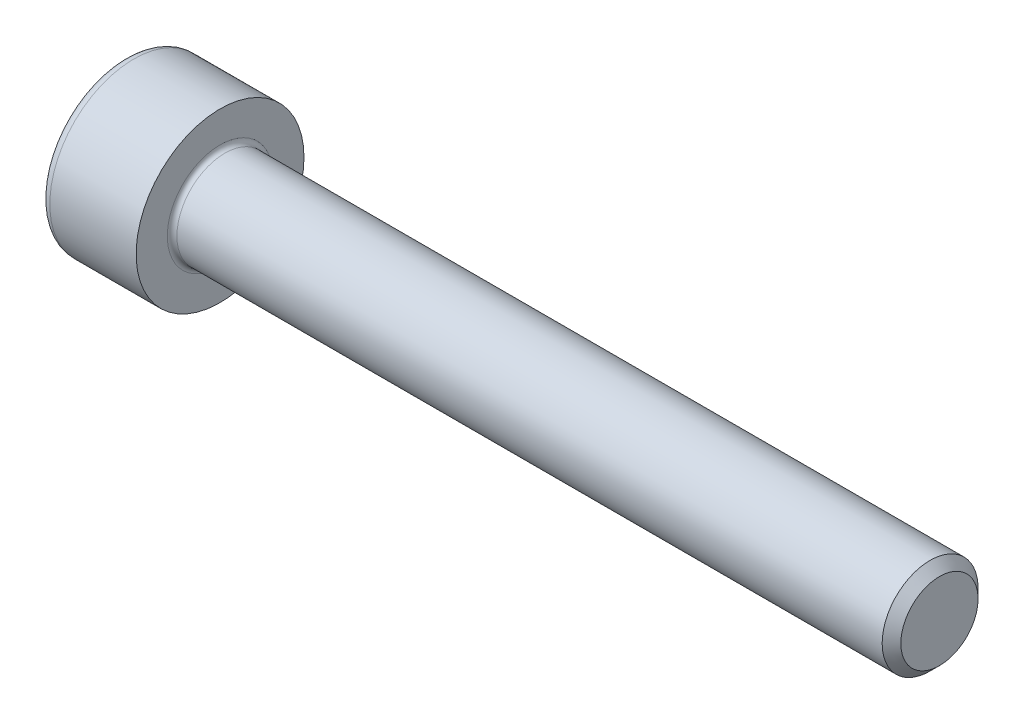
ISO-10303-21;
HEADER;
FILE_DESCRIPTION(('STEP AP214'),'2;1');
FILE_NAME('part.step','',(''),(''),'','','');
FILE_SCHEMA(('AUTOMOTIVE_DESIGN { 1 0 10303 214 1 1 1 1 }'));
ENDSEC;
DATA;
#1=APPLICATION_CONTEXT('core data for automotive mechanical design processes');
#2=APPLICATION_PROTOCOL_DEFINITION('international standard','automotive_design',2000,#1);
#3=PRODUCT_CONTEXT('',#1,'mechanical');
#4=PRODUCT('Part','Part','',(#3));
#5=PRODUCT_RELATED_PRODUCT_CATEGORY('part','',(#4));
#6=PRODUCT_DEFINITION_FORMATION('','',#4);
#7=PRODUCT_DEFINITION_CONTEXT('part definition',#1,'design');
#8=PRODUCT_DEFINITION('design','',#6,#7);
#9=PRODUCT_DEFINITION_SHAPE('','',#8);
#10=(LENGTH_UNIT() NAMED_UNIT(*) SI_UNIT(.MILLI.,.METRE.));
#11=(NAMED_UNIT(*) PLANE_ANGLE_UNIT() SI_UNIT($,.RADIAN.));
#12=(NAMED_UNIT(*) SI_UNIT($,.STERADIAN.) SOLID_ANGLE_UNIT());
#13=UNCERTAINTY_MEASURE_WITH_UNIT(LENGTH_MEASURE(1.E-05),#10,'distance_accuracy_value','');
#14=(GEOMETRIC_REPRESENTATION_CONTEXT(3) GLOBAL_UNCERTAINTY_ASSIGNED_CONTEXT((#13)) GLOBAL_UNIT_ASSIGNED_CONTEXT((#10,
#11,#12)) REPRESENTATION_CONTEXT('',''));
#15=CARTESIAN_POINT('',(0.,0.,0.));
#16=DIRECTION('',(0.,0.,1.));
#17=DIRECTION('',(1.,0.,0.));
#18=AXIS2_PLACEMENT_3D('',#15,#16,#17);
#19=CARTESIAN_POINT('',(2.,0.86602540378444,-1.5));
#20=DIRECTION('',(-1.,0.,0.));
#21=DIRECTION('',(0.,0.,1.));
#22=AXIS2_PLACEMENT_3D('',#19,#20,#21);
#23=PLANE('',#22);
#24=DIRECTION('',(0.,-1.,0.));
#25=VECTOR('',#24,1.);
#26=CARTESIAN_POINT('',(2.,0.86602540378444,1.5));
#27=LINE('',#26,#25);
#28=CARTESIAN_POINT('',(2.,0.,1.5));
#29=VERTEX_POINT('',#28);
#30=CARTESIAN_POINT('',(2.,-0.866025403784438,1.5));
#31=VERTEX_POINT('',#30);
#32=EDGE_CURVE('E167',#29,#31,#27,.T.);
#33=ORIENTED_EDGE('',*,*,#32,.F.);
#34=CARTESIAN_POINT('',(2.,0.,0.));
#35=DIRECTION('',(-1.,0.,0.));
#36=DIRECTION('',(0.,0.,1.));
#37=AXIS2_PLACEMENT_3D('',#34,#35,#36);
#38=CIRCLE('',#37,1.5);
#39=CARTESIAN_POINT('',(2.,-1.29903810567666,0.75));
#40=VERTEX_POINT('',#39);
#41=EDGE_CURVE('E50',#29,#40,#38,.F.);
#42=ORIENTED_EDGE('',*,*,#41,.T.);
#43=DIRECTION('',(0.,-0.5,-0.866025403784438));
#44=VECTOR('',#43,1.);
#45=CARTESIAN_POINT('',(2.,-0.866025403784438,1.5));
#46=LINE('',#45,#44);
#47=EDGE_CURVE('E173',#31,#40,#46,.T.);
#48=ORIENTED_EDGE('',*,*,#47,.F.);
#49=EDGE_LOOP('',(#33,#42,#48));
#50=FACE_BOUND('',#49,.T.);
#51=ADVANCED_FACE('F35',(#50),#23,.T.);
#52=CARTESIAN_POINT('',(2.,-1.73205080756888,0.));
#53=VERTEX_POINT('',#52);
#54=EDGE_CURVE('E172',#40,#53,#46,.T.);
#55=ORIENTED_EDGE('',*,*,#54,.F.);
#56=CARTESIAN_POINT('',(2.,-1.29903810567666,-0.75));
#57=VERTEX_POINT('',#56);
#58=EDGE_CURVE('E251',#40,#57,#38,.F.);
#59=ORIENTED_EDGE('',*,*,#58,.T.);
#60=DIRECTION('',(0.,0.5,-0.866025403784439));
#61=VECTOR('',#60,1.);
#62=CARTESIAN_POINT('',(2.,-1.73205080756888,0.));
#63=LINE('',#62,#61);
#64=EDGE_CURVE('E177',#53,#57,#63,.T.);
#65=ORIENTED_EDGE('',*,*,#64,.F.);
#66=EDGE_LOOP('',(#55,#59,#65));
#67=FACE_BOUND('',#66,.T.);
#68=ADVANCED_FACE('F122',(#67),#23,.T.);
#69=CARTESIAN_POINT('',(2.,-0.866025403784439,-1.5));
#70=VERTEX_POINT('',#69);
#71=EDGE_CURVE('E176',#57,#70,#63,.T.);
#72=ORIENTED_EDGE('',*,*,#71,.F.);
#73=CARTESIAN_POINT('',(2.,0.,-1.5));
#74=VERTEX_POINT('',#73);
#75=EDGE_CURVE('E247',#57,#74,#38,.F.);
#76=ORIENTED_EDGE('',*,*,#75,.T.);
#77=DIRECTION('',(0.,1.,0.));
#78=VECTOR('',#77,1.);
#79=CARTESIAN_POINT('',(2.,-0.866025403784439,-1.5));
#80=LINE('',#79,#78);
#81=EDGE_CURVE('E181',#70,#74,#80,.T.);
#82=ORIENTED_EDGE('',*,*,#81,.F.);
#83=EDGE_LOOP('',(#72,#76,#82));
#84=FACE_BOUND('',#83,.T.);
#85=ADVANCED_FACE('F129',(#84),#23,.T.);
#86=CARTESIAN_POINT('',(2.,0.86602540378444,-1.5));
#87=VERTEX_POINT('',#86);
#88=EDGE_CURVE('E180',#74,#87,#80,.T.);
#89=ORIENTED_EDGE('',*,*,#88,.F.);
#90=CARTESIAN_POINT('',(2.,1.29903810567666,-0.750000000000001));
#91=VERTEX_POINT('',#90);
#92=EDGE_CURVE('E246',#74,#91,#38,.F.);
#93=ORIENTED_EDGE('',*,*,#92,.T.);
#94=DIRECTION('',(0.,0.5,0.866025403784439));
#95=VECTOR('',#94,1.);
#96=CARTESIAN_POINT('',(2.,0.86602540378444,-1.5));
#97=LINE('',#96,#95);
#98=EDGE_CURVE('E157',#87,#91,#97,.T.);
#99=ORIENTED_EDGE('',*,*,#98,.F.);
#100=EDGE_LOOP('',(#89,#93,#99));
#101=FACE_BOUND('',#100,.T.);
#102=ADVANCED_FACE('F144',(#101),#23,.T.);
#103=CARTESIAN_POINT('',(2.,1.73205080756888,0.));
#104=VERTEX_POINT('',#103);
#105=EDGE_CURVE('E197',#91,#104,#97,.T.);
#106=ORIENTED_EDGE('',*,*,#105,.F.);
#107=CARTESIAN_POINT('',(2.,1.29903810567666,0.75));
#108=VERTEX_POINT('',#107);
#109=EDGE_CURVE('E222',#91,#108,#38,.F.);
#110=ORIENTED_EDGE('',*,*,#109,.T.);
#111=DIRECTION('',(0.,-0.5,0.866025403784439));
#112=VECTOR('',#111,1.);
#113=CARTESIAN_POINT('',(2.,1.73205080756888,0.));
#114=LINE('',#113,#112);
#115=EDGE_CURVE('E156',#104,#108,#114,.T.);
#116=ORIENTED_EDGE('',*,*,#115,.F.);
#117=EDGE_LOOP('',(#106,#110,#116));
#118=FACE_BOUND('',#117,.T.);
#119=ADVANCED_FACE('F135',(#118),#23,.T.);
#120=CARTESIAN_POINT('',(2.,0.86602540378444,1.5));
#121=VERTEX_POINT('',#120);
#122=EDGE_CURVE('E148',#108,#121,#114,.T.);
#123=ORIENTED_EDGE('',*,*,#122,.F.);
#124=EDGE_CURVE('E150',#108,#29,#38,.F.);
#125=ORIENTED_EDGE('',*,*,#124,.T.);
#126=EDGE_CURVE('E152',#121,#29,#27,.T.);
#127=ORIENTED_EDGE('',*,*,#126,.F.);
#128=EDGE_LOOP('',(#123,#125,#127));
#129=FACE_BOUND('',#128,.T.);
#130=ADVANCED_FACE('F125',(#129),#23,.T.);
#131=CARTESIAN_POINT('',(0.,0.,0.));
#132=DIRECTION('',(1.,0.,0.));
#133=DIRECTION('',(0.,0.,-1.));
#134=AXIS2_PLACEMENT_3D('',#131,#132,#133);
#135=PLANE('',#134);
#136=CARTESIAN_POINT('',(0.,0.,0.));
#137=DIRECTION('',(1.,0.,0.));
#138=DIRECTION('',(0.,0.,-1.));
#139=AXIS2_PLACEMENT_3D('',#136,#137,#138);
#140=CIRCLE('',#139,3.1);
#141=CARTESIAN_POINT('',(0.,0.,-3.1));
#142=VERTEX_POINT('',#141);
#143=EDGE_CURVE('E11',#142,#142,#140,.F.);
#144=ORIENTED_EDGE('',*,*,#143,.T.);
#145=EDGE_LOOP('',(#144));
#146=FACE_BOUND('',#145,.T.);
#147=DIRECTION('',(0.,0.5,0.866025403784439));
#148=VECTOR('',#147,1.);
#149=CARTESIAN_POINT('',(0.,0.86602540378444,-1.5));
#150=LINE('',#149,#148);
#151=CARTESIAN_POINT('',(0.,0.86602540378444,-1.5));
#152=VERTEX_POINT('',#151);
#153=CARTESIAN_POINT('',(0.,1.73205080756888,0.));
#154=VERTEX_POINT('',#153);
#155=EDGE_CURVE('E185',#152,#154,#150,.T.);
#156=ORIENTED_EDGE('',*,*,#155,.T.);
#157=DIRECTION('',(0.,-0.5,0.866025403784439));
#158=VECTOR('',#157,1.);
#159=CARTESIAN_POINT('',(0.,1.73205080756888,0.));
#160=LINE('',#159,#158);
#161=CARTESIAN_POINT('',(0.,0.86602540378444,1.5));
#162=VERTEX_POINT('',#161);
#163=EDGE_CURVE('E187',#154,#162,#160,.T.);
#164=ORIENTED_EDGE('',*,*,#163,.T.);
#165=DIRECTION('',(0.,-1.,0.));
#166=VECTOR('',#165,1.);
#167=CARTESIAN_POINT('',(0.,0.86602540378444,1.5));
#168=LINE('',#167,#166);
#169=CARTESIAN_POINT('',(0.,-0.866025403784438,1.5));
#170=VERTEX_POINT('',#169);
#171=EDGE_CURVE('E190',#162,#170,#168,.T.);
#172=ORIENTED_EDGE('',*,*,#171,.T.);
#173=DIRECTION('',(0.,-0.5,-0.866025403784438));
#174=VECTOR('',#173,1.);
#175=CARTESIAN_POINT('',(0.,-0.866025403784438,1.5));
#176=LINE('',#175,#174);
#177=CARTESIAN_POINT('',(0.,-1.73205080756888,0.));
#178=VERTEX_POINT('',#177);
#179=EDGE_CURVE('E192',#170,#178,#176,.T.);
#180=ORIENTED_EDGE('',*,*,#179,.T.);
#181=DIRECTION('',(0.,0.5,-0.866025403784439));
#182=VECTOR('',#181,1.);
#183=CARTESIAN_POINT('',(0.,-1.73205080756888,0.));
#184=LINE('',#183,#182);
#185=CARTESIAN_POINT('',(0.,-0.866025403784439,-1.5));
#186=VERTEX_POINT('',#185);
#187=EDGE_CURVE('E194',#178,#186,#184,.T.);
#188=ORIENTED_EDGE('',*,*,#187,.T.);
#189=DIRECTION('',(0.,1.,0.));
#190=VECTOR('',#189,1.);
#191=CARTESIAN_POINT('',(0.,-0.866025403784439,-1.5));
#192=LINE('',#191,#190);
#193=EDGE_CURVE('E58',#186,#152,#192,.T.);
#194=ORIENTED_EDGE('',*,*,#193,.T.);
#195=EDGE_LOOP('',(#156,#164,#172,#180,#188,#194));
#196=FACE_BOUND('',#195,.T.);
#197=ADVANCED_FACE('F134',(#146,#196),#135,.F.);
#198=CARTESIAN_POINT('',(4.,0.,0.));
#199=DIRECTION('',(1.,0.,0.));
#200=DIRECTION('',(0.,0.,-1.));
#201=AXIS2_PLACEMENT_3D('',#198,#199,#200);
#202=PLANE('',#201);
#203=CARTESIAN_POINT('',(4.,0.,0.));
#204=DIRECTION('',(1.,0.,0.));
#205=DIRECTION('',(0.,0.,-1.));
#206=AXIS2_PLACEMENT_3D('',#203,#204,#205);
#207=CIRCLE('',#206,2.2);
#208=CARTESIAN_POINT('',(4.,0.,-2.2));
#209=VERTEX_POINT('',#208);
#210=EDGE_CURVE('E223',#209,#209,#207,.F.);
#211=ORIENTED_EDGE('',*,*,#210,.T.);
#212=EDGE_LOOP('',(#211));
#213=FACE_BOUND('',#212,.T.);
#214=CARTESIAN_POINT('',(4.,0.,0.));
#215=DIRECTION('',(1.,0.,0.));
#216=DIRECTION('',(0.,0.,-1.));
#217=AXIS2_PLACEMENT_3D('',#214,#215,#216);
#218=CIRCLE('',#217,3.5);
#219=CARTESIAN_POINT('',(4.,0.,-3.5));
#220=VERTEX_POINT('',#219);
#221=EDGE_CURVE('E218',#220,#220,#218,.T.);
#222=ORIENTED_EDGE('',*,*,#221,.T.);
#223=EDGE_LOOP('',(#222));
#224=FACE_BOUND('',#223,.T.);
#225=ADVANCED_FACE('F141',(#213,#224),#202,.T.);
#226=CARTESIAN_POINT('',(4.,0.,0.));
#227=DIRECTION('',(-1.,0.,0.));
#228=DIRECTION('',(0.,0.,1.));
#229=AXIS2_PLACEMENT_3D('',#226,#227,#228);
#230=CYLINDRICAL_SURFACE('',#229,3.5);
#231=CARTESIAN_POINT('',(0.4,0.,0.));
#232=DIRECTION('',(1.,0.,0.));
#233=DIRECTION('',(0.,0.,-1.));
#234=AXIS2_PLACEMENT_3D('',#231,#232,#233);
#235=CIRCLE('',#234,3.5);
#236=CARTESIAN_POINT('',(0.4,0.,-3.5));
#237=VERTEX_POINT('',#236);
#238=EDGE_CURVE('E43',#237,#237,#235,.T.);
#239=ORIENTED_EDGE('',*,*,#238,.T.);
#240=EDGE_LOOP('',(#239));
#241=FACE_BOUND('',#240,.T.);
#242=ORIENTED_EDGE('',*,*,#221,.F.);
#243=EDGE_LOOP('',(#242));
#244=FACE_BOUND('',#243,.T.);
#245=ADVANCED_FACE('F231',(#241,#244),#230,.T.);
#246=CARTESIAN_POINT('',(34.,0.,0.));
#247=DIRECTION('',(-1.,0.,0.));
#248=DIRECTION('',(0.,0.,1.));
#249=AXIS2_PLACEMENT_3D('',#246,#247,#248);
#250=PLANE('',#249);
#251=CARTESIAN_POINT('',(34.,0.,0.));
#252=DIRECTION('',(-1.,0.,0.));
#253=DIRECTION('',(0.,0.,1.));
#254=AXIS2_PLACEMENT_3D('',#251,#252,#253);
#255=CIRCLE('',#254,1.61);
#256=CARTESIAN_POINT('',(34.,0.,1.61));
#257=VERTEX_POINT('',#256);
#258=EDGE_CURVE('E215',#257,#257,#255,.T.);
#259=ORIENTED_EDGE('',*,*,#258,.F.);
#260=EDGE_LOOP('',(#259));
#261=FACE_BOUND('',#260,.T.);
#262=ADVANCED_FACE('F388',(#261),#250,.F.);
#263=CARTESIAN_POINT('',(34.,0.,0.));
#264=DIRECTION('',(-1.,0.,0.));
#265=DIRECTION('',(0.,0.,1.));
#266=AXIS2_PLACEMENT_3D('',#263,#264,#265);
#267=CONICAL_SURFACE('',#266,1.61,0.785398163397445);
#268=CARTESIAN_POINT('',(33.61,0.,0.));
#269=DIRECTION('',(-1.,0.,0.));
#270=DIRECTION('',(0.,0.,1.));
#271=AXIS2_PLACEMENT_3D('',#268,#269,#270);
#272=CIRCLE('',#271,2.);
#273=CARTESIAN_POINT('',(33.61,0.,2.));
#274=VERTEX_POINT('',#273);
#275=EDGE_CURVE('E212',#274,#274,#272,.T.);
#276=ORIENTED_EDGE('',*,*,#275,.F.);
#277=EDGE_LOOP('',(#276));
#278=FACE_BOUND('',#277,.T.);
#279=ORIENTED_EDGE('',*,*,#258,.T.);
#280=EDGE_LOOP('',(#279));
#281=FACE_BOUND('',#280,.T.);
#282=ADVANCED_FACE('F368',(#278,#281),#267,.T.);
#283=CARTESIAN_POINT('',(0.,0.,0.));
#284=DIRECTION('',(-1.,0.,0.));
#285=DIRECTION('',(0.,0.,1.));
#286=AXIS2_PLACEMENT_3D('',#283,#284,#285);
#287=CYLINDRICAL_SURFACE('',#286,2.);
#288=CARTESIAN_POINT('',(4.2,0.,0.));
#289=DIRECTION('',(1.,0.,0.));
#290=DIRECTION('',(0.,0.,-1.));
#291=AXIS2_PLACEMENT_3D('',#288,#289,#290);
#292=CIRCLE('',#291,2.);
#293=CARTESIAN_POINT('',(4.2,0.,-2.));
#294=VERTEX_POINT('',#293);
#295=EDGE_CURVE('E226',#294,#294,#292,.T.);
#296=ORIENTED_EDGE('',*,*,#295,.T.);
#297=EDGE_LOOP('',(#296));
#298=FACE_BOUND('',#297,.T.);
#299=ORIENTED_EDGE('',*,*,#275,.T.);
#300=EDGE_LOOP('',(#299));
#301=FACE_BOUND('',#300,.T.);
#302=ADVANCED_FACE('F295',(#298,#301),#287,.T.);
#303=CARTESIAN_POINT('',(2.,0.86602540378444,-1.5));
#304=DIRECTION('',(0.,-0.866025403784439,0.5));
#305=DIRECTION('',(0.,-0.5,-0.866025403784439));
#306=AXIS2_PLACEMENT_3D('',#303,#304,#305);
#307=PLANE('',#306);
#308=ORIENTED_EDGE('',*,*,#98,.T.);
#309=ORIENTED_EDGE('',*,*,#105,.T.);
#310=DIRECTION('',(-1.,0.,0.));
#311=VECTOR('',#310,1.);
#312=CARTESIAN_POINT('',(2.,1.73205080756888,0.));
#313=LINE('',#312,#311);
#314=EDGE_CURVE('E164',#104,#154,#313,.T.);
#315=ORIENTED_EDGE('',*,*,#314,.T.);
#316=ORIENTED_EDGE('',*,*,#155,.F.);
#317=DIRECTION('',(-1.,0.,0.));
#318=VECTOR('',#317,1.);
#319=CARTESIAN_POINT('',(2.,0.86602540378444,-1.5));
#320=LINE('',#319,#318);
#321=EDGE_CURVE('E184',#87,#152,#320,.T.);
#322=ORIENTED_EDGE('',*,*,#321,.F.);
#323=EDGE_LOOP('',(#308,#309,#315,#316,#322));
#324=FACE_BOUND('',#323,.T.);
#325=ADVANCED_FACE('F243',(#324),#307,.T.);
#326=CARTESIAN_POINT('',(2.,1.73205080756888,0.));
#327=DIRECTION('',(0.,-0.866025403784439,-0.5));
#328=DIRECTION('',(0.,0.5,-0.866025403784439));
#329=AXIS2_PLACEMENT_3D('',#326,#327,#328);
#330=PLANE('',#329);
#331=ORIENTED_EDGE('',*,*,#115,.T.);
#332=ORIENTED_EDGE('',*,*,#122,.T.);
#333=DIRECTION('',(-1.,0.,0.));
#334=VECTOR('',#333,1.);
#335=CARTESIAN_POINT('',(2.,0.86602540378444,1.5));
#336=LINE('',#335,#334);
#337=EDGE_CURVE('E209',#121,#162,#336,.T.);
#338=ORIENTED_EDGE('',*,*,#337,.T.);
#339=ORIENTED_EDGE('',*,*,#163,.F.);
#340=ORIENTED_EDGE('',*,*,#314,.F.);
#341=EDGE_LOOP('',(#331,#332,#338,#339,#340));
#342=FACE_BOUND('',#341,.T.);
#343=ADVANCED_FACE('F161',(#342),#330,.T.);
#344=CARTESIAN_POINT('',(2.,0.86602540378444,1.5));
#345=DIRECTION('',(0.,0.,-1.));
#346=DIRECTION('',(-1.,0.,0.));
#347=AXIS2_PLACEMENT_3D('',#344,#345,#346);
#348=PLANE('',#347);
#349=ORIENTED_EDGE('',*,*,#126,.T.);
#350=ORIENTED_EDGE('',*,*,#32,.T.);
#351=DIRECTION('',(-1.,0.,0.));
#352=VECTOR('',#351,1.);
#353=CARTESIAN_POINT('',(2.,-0.866025403784438,1.5));
#354=LINE('',#353,#352);
#355=EDGE_CURVE('E206',#31,#170,#354,.T.);
#356=ORIENTED_EDGE('',*,*,#355,.T.);
#357=ORIENTED_EDGE('',*,*,#171,.F.);
#358=ORIENTED_EDGE('',*,*,#337,.F.);
#359=EDGE_LOOP('',(#349,#350,#356,#357,#358));
#360=FACE_BOUND('',#359,.T.);
#361=ADVANCED_FACE('F265',(#360),#348,.T.);
#362=CARTESIAN_POINT('',(2.,-0.866025403784438,1.5));
#363=DIRECTION('',(0.,0.866025403784439,-0.5));
#364=DIRECTION('',(0.,0.5,0.866025403784439));
#365=AXIS2_PLACEMENT_3D('',#362,#363,#364);
#366=PLANE('',#365);
#367=ORIENTED_EDGE('',*,*,#47,.T.);
#368=ORIENTED_EDGE('',*,*,#54,.T.);
#369=DIRECTION('',(-1.,0.,0.));
#370=VECTOR('',#369,1.);
#371=CARTESIAN_POINT('',(2.,-1.73205080756888,0.));
#372=LINE('',#371,#370);
#373=EDGE_CURVE('E203',#53,#178,#372,.T.);
#374=ORIENTED_EDGE('',*,*,#373,.T.);
#375=ORIENTED_EDGE('',*,*,#179,.F.);
#376=ORIENTED_EDGE('',*,*,#355,.F.);
#377=EDGE_LOOP('',(#367,#368,#374,#375,#376));
#378=FACE_BOUND('',#377,.T.);
#379=ADVANCED_FACE('F262',(#378),#366,.T.);
#380=CARTESIAN_POINT('',(2.,-1.73205080756888,0.));
#381=DIRECTION('',(0.,0.866025403784439,0.5));
#382=DIRECTION('',(0.,-0.5,0.866025403784439));
#383=AXIS2_PLACEMENT_3D('',#380,#381,#382);
#384=PLANE('',#383);
#385=ORIENTED_EDGE('',*,*,#64,.T.);
#386=ORIENTED_EDGE('',*,*,#71,.T.);
#387=DIRECTION('',(-1.,0.,0.));
#388=VECTOR('',#387,1.);
#389=CARTESIAN_POINT('',(2.,-0.866025403784439,-1.5));
#390=LINE('',#389,#388);
#391=EDGE_CURVE('E200',#70,#186,#390,.T.);
#392=ORIENTED_EDGE('',*,*,#391,.T.);
#393=ORIENTED_EDGE('',*,*,#187,.F.);
#394=ORIENTED_EDGE('',*,*,#373,.F.);
#395=EDGE_LOOP('',(#385,#386,#392,#393,#394));
#396=FACE_BOUND('',#395,.T.);
#397=ADVANCED_FACE('F268',(#396),#384,.T.);
#398=CARTESIAN_POINT('',(2.,-0.866025403784439,-1.5));
#399=DIRECTION('',(0.,0.,1.));
#400=DIRECTION('',(0.,-1.,0.));
#401=AXIS2_PLACEMENT_3D('',#398,#399,#400);
#402=PLANE('',#401);
#403=ORIENTED_EDGE('',*,*,#81,.T.);
#404=ORIENTED_EDGE('',*,*,#88,.T.);
#405=ORIENTED_EDGE('',*,*,#321,.T.);
#406=ORIENTED_EDGE('',*,*,#193,.F.);
#407=ORIENTED_EDGE('',*,*,#391,.F.);
#408=EDGE_LOOP('',(#403,#404,#405,#406,#407));
#409=FACE_BOUND('',#408,.T.);
#410=ADVANCED_FACE('F118',(#409),#402,.T.);
#411=CARTESIAN_POINT('',(0.,0.,0.));
#412=DIRECTION('',(-1.,0.,0.));
#413=DIRECTION('',(0.,0.,1.));
#414=AXIS2_PLACEMENT_3D('',#411,#412,#413);
#415=CYLINDRICAL_SURFACE('',#414,1.5);
#416=ORIENTED_EDGE('',*,*,#124,.F.);
#417=ORIENTED_EDGE('',*,*,#109,.F.);
#418=ORIENTED_EDGE('',*,*,#92,.F.);
#419=ORIENTED_EDGE('',*,*,#75,.F.);
#420=ORIENTED_EDGE('',*,*,#58,.F.);
#421=ORIENTED_EDGE('',*,*,#41,.F.);
#422=EDGE_LOOP('',(#416,#417,#418,#419,#420,#421));
#423=FACE_BOUND('',#422,.T.);
#424=CARTESIAN_POINT('',(2.6,0.,0.));
#425=DIRECTION('',(-1.,0.,0.));
#426=DIRECTION('',(0.,0.,1.));
#427=AXIS2_PLACEMENT_3D('',#424,#425,#426);
#428=CIRCLE('',#427,1.5);
#429=CARTESIAN_POINT('',(2.6,0.,1.5));
#430=VERTEX_POINT('',#429);
#431=EDGE_CURVE('E188',#430,#430,#428,.T.);
#432=ORIENTED_EDGE('',*,*,#431,.F.);
#433=EDGE_LOOP('',(#432));
#434=FACE_BOUND('',#433,.T.);
#435=ADVANCED_FACE('F110',(#423,#434),#415,.F.);
#436=CARTESIAN_POINT('',(3.46602540378445,0.,0.));
#437=DIRECTION('',(-1.,0.,0.));
#438=DIRECTION('',(0.,0.,1.));
#439=AXIS2_PLACEMENT_3D('',#436,#437,#438);
#440=CONICAL_SURFACE('',#439,0.,1.04719755119659);
#441=ORIENTED_EDGE('',*,*,#431,.T.);
#442=EDGE_LOOP('',(#441));
#443=FACE_BOUND('',#442,.T.);
#444=CARTESIAN_POINT('',(3.46602540378445,0.,0.));
#445=VERTEX_POINT('',#444);
#446=VERTEX_LOOP('',#445);
#447=FACE_BOUND('',#446,.T.);
#448=ADVANCED_FACE('F107',(#443,#447),#440,.F.);
#449=CARTESIAN_POINT('',(4.2,0.,0.));
#450=DIRECTION('',(1.,0.,0.));
#451=DIRECTION('',(0.,0.,-1.));
#452=AXIS2_PLACEMENT_3D('',#449,#450,#451);
#453=TOROIDAL_SURFACE('',#452,2.2,0.2);
#454=ORIENTED_EDGE('',*,*,#295,.F.);
#455=EDGE_LOOP('',(#454));
#456=FACE_BOUND('',#455,.T.);
#457=ORIENTED_EDGE('',*,*,#210,.F.);
#458=EDGE_LOOP('',(#457));
#459=FACE_BOUND('',#458,.T.);
#460=ADVANCED_FACE('F109',(#456,#459),#453,.F.);
#461=CARTESIAN_POINT('',(0.4,0.,0.));
#462=DIRECTION('',(1.,0.,0.));
#463=DIRECTION('',(0.,0.,-1.));
#464=AXIS2_PLACEMENT_3D('',#461,#462,#463);
#465=TOROIDAL_SURFACE('',#464,3.1,0.4);
#466=ORIENTED_EDGE('',*,*,#143,.F.);
#467=EDGE_LOOP('',(#466));
#468=FACE_BOUND('',#467,.T.);
#469=ORIENTED_EDGE('',*,*,#238,.F.);
#470=EDGE_LOOP('',(#469));
#471=FACE_BOUND('',#470,.T.);
#472=ADVANCED_FACE('F37',(#468,#471),#465,.T.);
#473=CLOSED_SHELL('',(#51,#68,#85,#102,#119,#130,#197,#225,#245,#262,#282,#302,#325,#343,#361,
#379,#397,#410,#435,#448,#460,#472));
#474=MANIFOLD_SOLID_BREP('B2',#473);
#475=ADVANCED_BREP_SHAPE_REPRESENTATION('',(#18,#474),#14);
#476=SHAPE_DEFINITION_REPRESENTATION(#9,#475);
ENDSEC;
END-ISO-10303-21;
